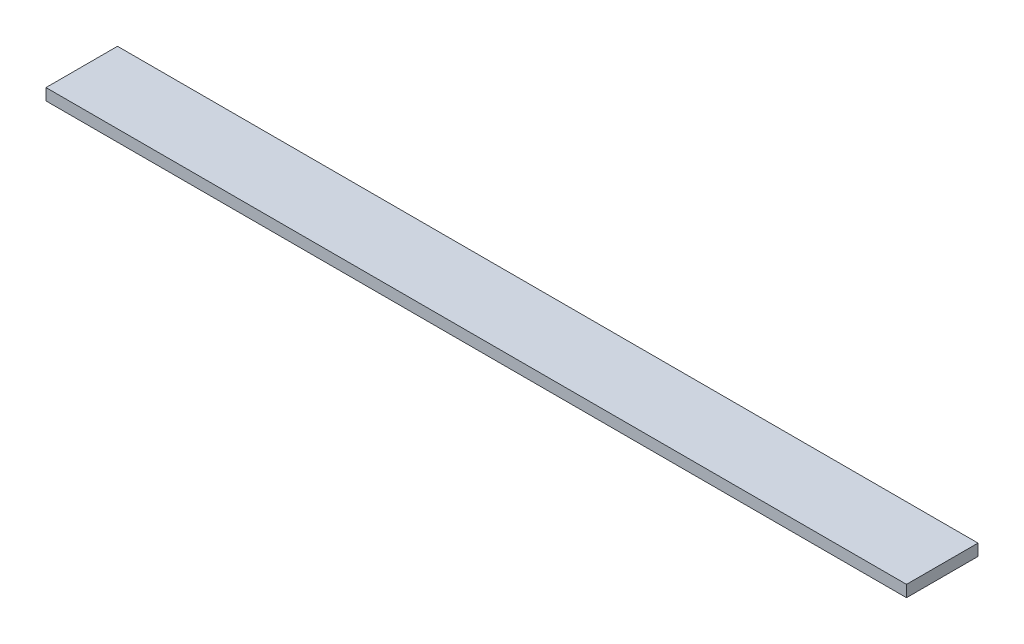
ISO-10303-21;
HEADER;
FILE_DESCRIPTION(('STEP AP214'),'2;1');
FILE_NAME('part.step','',(''),(''),'','','');
FILE_SCHEMA(('AUTOMOTIVE_DESIGN { 1 0 10303 214 1 1 1 1 }'));
ENDSEC;
DATA;
#1=APPLICATION_CONTEXT('core data for automotive mechanical design processes');
#2=APPLICATION_PROTOCOL_DEFINITION('international standard','automotive_design',2000,#1);
#3=PRODUCT_CONTEXT('',#1,'mechanical');
#4=PRODUCT('Part','Part','',(#3));
#5=PRODUCT_RELATED_PRODUCT_CATEGORY('part','',(#4));
#6=PRODUCT_DEFINITION_FORMATION('','',#4);
#7=PRODUCT_DEFINITION_CONTEXT('part definition',#1,'design');
#8=PRODUCT_DEFINITION('design','',#6,#7);
#9=PRODUCT_DEFINITION_SHAPE('','',#8);
#10=(LENGTH_UNIT() NAMED_UNIT(*) SI_UNIT(.MILLI.,.METRE.));
#11=(NAMED_UNIT(*) PLANE_ANGLE_UNIT() SI_UNIT($,.RADIAN.));
#12=(NAMED_UNIT(*) SI_UNIT($,.STERADIAN.) SOLID_ANGLE_UNIT());
#13=UNCERTAINTY_MEASURE_WITH_UNIT(LENGTH_MEASURE(1.E-05),#10,'distance_accuracy_value','');
#14=(GEOMETRIC_REPRESENTATION_CONTEXT(3) GLOBAL_UNCERTAINTY_ASSIGNED_CONTEXT((#13)) GLOBAL_UNIT_ASSIGNED_CONTEXT((#10,
#11,#12)) REPRESENTATION_CONTEXT('',''));
#15=CARTESIAN_POINT('',(0.,0.,0.));
#16=DIRECTION('',(0.,0.,1.));
#17=DIRECTION('',(1.,0.,0.));
#18=AXIS2_PLACEMENT_3D('',#15,#16,#17);
#19=CARTESIAN_POINT('',(-721.173913043478,38.1,-422.058695652177));
#20=DIRECTION('',(1.,0.,0.));
#21=DIRECTION('',(0.,0.,-1.));
#22=AXIS2_PLACEMENT_3D('',#19,#20,#21);
#23=PLANE('',#22);
#24=DIRECTION('',(0.,0.,1.));
#25=VECTOR('',#24,1.);
#26=CARTESIAN_POINT('',(-721.173913043478,0.,-422.058695652178));
#27=LINE('',#26,#25);
#28=CARTESIAN_POINT('',(-721.173913043478,0.,-422.058695652178));
#29=VERTEX_POINT('',#28);
#30=CARTESIAN_POINT('',(-721.17391304348,0.,-187.108695652175));
#31=VERTEX_POINT('',#30);
#32=EDGE_CURVE('E95',#29,#31,#27,.T.);
#33=ORIENTED_EDGE('',*,*,#32,.T.);
#34=DIRECTION('',(0.,-1.,0.));
#35=VECTOR('',#34,1.);
#36=CARTESIAN_POINT('',(-721.17391304348,38.1,-187.108695652177));
#37=LINE('',#36,#35);
#38=CARTESIAN_POINT('',(-721.17391304348,38.1,-187.108695652177));
#39=VERTEX_POINT('',#38);
#40=EDGE_CURVE('E11',#39,#31,#37,.T.);
#41=ORIENTED_EDGE('',*,*,#40,.F.);
#42=DIRECTION('',(0.,0.,1.));
#43=VECTOR('',#42,1.);
#44=CARTESIAN_POINT('',(-721.173913043478,38.1,-422.058695652177));
#45=LINE('',#44,#43);
#46=CARTESIAN_POINT('',(-721.173913043478,38.1,-422.058695652177));
#47=VERTEX_POINT('',#46);
#48=EDGE_CURVE('E81',#47,#39,#45,.T.);
#49=ORIENTED_EDGE('',*,*,#48,.F.);
#50=DIRECTION('',(0.,-1.,0.));
#51=VECTOR('',#50,1.);
#52=CARTESIAN_POINT('',(-721.173913043478,38.1,-422.058695652177));
#53=LINE('',#52,#51);
#54=EDGE_CURVE('E48',#47,#29,#53,.T.);
#55=ORIENTED_EDGE('',*,*,#54,.T.);
#56=EDGE_LOOP('',(#33,#41,#49,#55));
#57=FACE_BOUND('',#56,.T.);
#58=ADVANCED_FACE('F32',(#57),#23,.F.);
#59=CARTESIAN_POINT('',(-721.17391304348,38.1,-187.108695652177));
#60=DIRECTION('',(0.,0.,-1.));
#61=DIRECTION('',(-1.,0.,0.));
#62=AXIS2_PLACEMENT_3D('',#59,#60,#61);
#63=PLANE('',#62);
#64=DIRECTION('',(1.,0.,0.));
#65=VECTOR('',#64,1.);
#66=CARTESIAN_POINT('',(-721.17391304348,0.,-187.108695652175));
#67=LINE('',#66,#65);
#68=CARTESIAN_POINT('',(2106.16358695652,0.,-187.108695652173));
#69=VERTEX_POINT('',#68);
#70=EDGE_CURVE('E86',#31,#69,#67,.T.);
#71=ORIENTED_EDGE('',*,*,#70,.T.);
#72=DIRECTION('',(0.,-1.,0.));
#73=VECTOR('',#72,1.);
#74=CARTESIAN_POINT('',(2106.16358695652,38.1,-187.108695652173));
#75=LINE('',#74,#73);
#76=CARTESIAN_POINT('',(2106.16358695652,38.1,-187.108695652173));
#77=VERTEX_POINT('',#76);
#78=EDGE_CURVE('E40',#77,#69,#75,.T.);
#79=ORIENTED_EDGE('',*,*,#78,.F.);
#80=DIRECTION('',(1.,0.,0.));
#81=VECTOR('',#80,1.);
#82=CARTESIAN_POINT('',(-721.17391304348,38.1,-187.108695652177));
#83=LINE('',#82,#81);
#84=EDGE_CURVE('E73',#39,#77,#83,.T.);
#85=ORIENTED_EDGE('',*,*,#84,.F.);
#86=ORIENTED_EDGE('',*,*,#40,.T.);
#87=EDGE_LOOP('',(#71,#79,#85,#86));
#88=FACE_BOUND('',#87,.T.);
#89=ADVANCED_FACE('F85',(#88),#63,.F.);
#90=CARTESIAN_POINT('',(2106.16358695652,38.1,-422.058695652169));
#91=DIRECTION('',(1.,0.,0.));
#92=DIRECTION('',(0.,0.,-1.));
#93=AXIS2_PLACEMENT_3D('',#90,#91,#92);
#94=PLANE('',#93);
#95=DIRECTION('',(0.,0.,1.));
#96=VECTOR('',#95,1.);
#97=CARTESIAN_POINT('',(2106.16358695652,0.,-422.058695652169));
#98=LINE('',#97,#96);
#99=CARTESIAN_POINT('',(2106.16358695652,0.,-422.058695652169));
#100=VERTEX_POINT('',#99);
#101=EDGE_CURVE('E98',#100,#69,#98,.T.);
#102=ORIENTED_EDGE('',*,*,#101,.F.);
#103=DIRECTION('',(0.,-1.,0.));
#104=VECTOR('',#103,1.);
#105=CARTESIAN_POINT('',(2106.16358695652,38.1,-422.058695652169));
#106=LINE('',#105,#104);
#107=CARTESIAN_POINT('',(2106.16358695652,38.1,-422.058695652169));
#108=VERTEX_POINT('',#107);
#109=EDGE_CURVE('E62',#108,#100,#106,.T.);
#110=ORIENTED_EDGE('',*,*,#109,.F.);
#111=DIRECTION('',(0.,0.,1.));
#112=VECTOR('',#111,1.);
#113=CARTESIAN_POINT('',(2106.16358695652,38.1,-422.058695652169));
#114=LINE('',#113,#112);
#115=EDGE_CURVE('E80',#108,#77,#114,.T.);
#116=ORIENTED_EDGE('',*,*,#115,.T.);
#117=ORIENTED_EDGE('',*,*,#78,.T.);
#118=EDGE_LOOP('',(#102,#110,#116,#117));
#119=FACE_BOUND('',#118,.T.);
#120=ADVANCED_FACE('F89',(#119),#94,.T.);
#121=CARTESIAN_POINT('',(-721.173913043478,38.1,-422.058695652177));
#122=DIRECTION('',(0.,0.,-1.));
#123=DIRECTION('',(-1.,0.,0.));
#124=AXIS2_PLACEMENT_3D('',#121,#122,#123);
#125=PLANE('',#124);
#126=DIRECTION('',(1.,0.,0.));
#127=VECTOR('',#126,1.);
#128=CARTESIAN_POINT('',(-721.173913043478,0.,-422.058695652178));
#129=LINE('',#128,#127);
#130=EDGE_CURVE('E100',#29,#100,#129,.T.);
#131=ORIENTED_EDGE('',*,*,#130,.F.);
#132=ORIENTED_EDGE('',*,*,#54,.F.);
#133=DIRECTION('',(1.,0.,0.));
#134=VECTOR('',#133,1.);
#135=CARTESIAN_POINT('',(-721.173913043478,38.1,-422.058695652177));
#136=LINE('',#135,#134);
#137=EDGE_CURVE('E90',#47,#108,#136,.T.);
#138=ORIENTED_EDGE('',*,*,#137,.T.);
#139=ORIENTED_EDGE('',*,*,#109,.T.);
#140=EDGE_LOOP('',(#131,#132,#138,#139));
#141=FACE_BOUND('',#140,.T.);
#142=ADVANCED_FACE('F106',(#141),#125,.T.);
#143=CARTESIAN_POINT('',(0.,38.1,4.44089209850063E-13));
#144=DIRECTION('',(0.,1.,0.));
#145=DIRECTION('',(0.,0.,1.));
#146=AXIS2_PLACEMENT_3D('',#143,#144,#145);
#147=PLANE('',#146);
#148=ORIENTED_EDGE('',*,*,#48,.T.);
#149=ORIENTED_EDGE('',*,*,#84,.T.);
#150=ORIENTED_EDGE('',*,*,#115,.F.);
#151=ORIENTED_EDGE('',*,*,#137,.F.);
#152=EDGE_LOOP('',(#148,#149,#150,#151));
#153=FACE_BOUND('',#152,.T.);
#154=ADVANCED_FACE('F77',(#153),#147,.T.);
#155=CARTESIAN_POINT('',(0.,0.,0.));
#156=DIRECTION('',(0.,1.,0.));
#157=DIRECTION('',(0.,0.,1.));
#158=AXIS2_PLACEMENT_3D('',#155,#156,#157);
#159=PLANE('',#158);
#160=ORIENTED_EDGE('',*,*,#32,.F.);
#161=ORIENTED_EDGE('',*,*,#130,.T.);
#162=ORIENTED_EDGE('',*,*,#101,.T.);
#163=ORIENTED_EDGE('',*,*,#70,.F.);
#164=EDGE_LOOP('',(#160,#161,#162,#163));
#165=FACE_BOUND('',#164,.T.);
#166=ADVANCED_FACE('F105',(#165),#159,.F.);
#167=CLOSED_SHELL('',(#58,#89,#120,#142,#154,#166));
#168=MANIFOLD_SOLID_BREP('B2',#167);
#169=ADVANCED_BREP_SHAPE_REPRESENTATION('',(#18,#168),#14);
#170=SHAPE_DEFINITION_REPRESENTATION(#9,#169);
ENDSEC;
END-ISO-10303-21;
